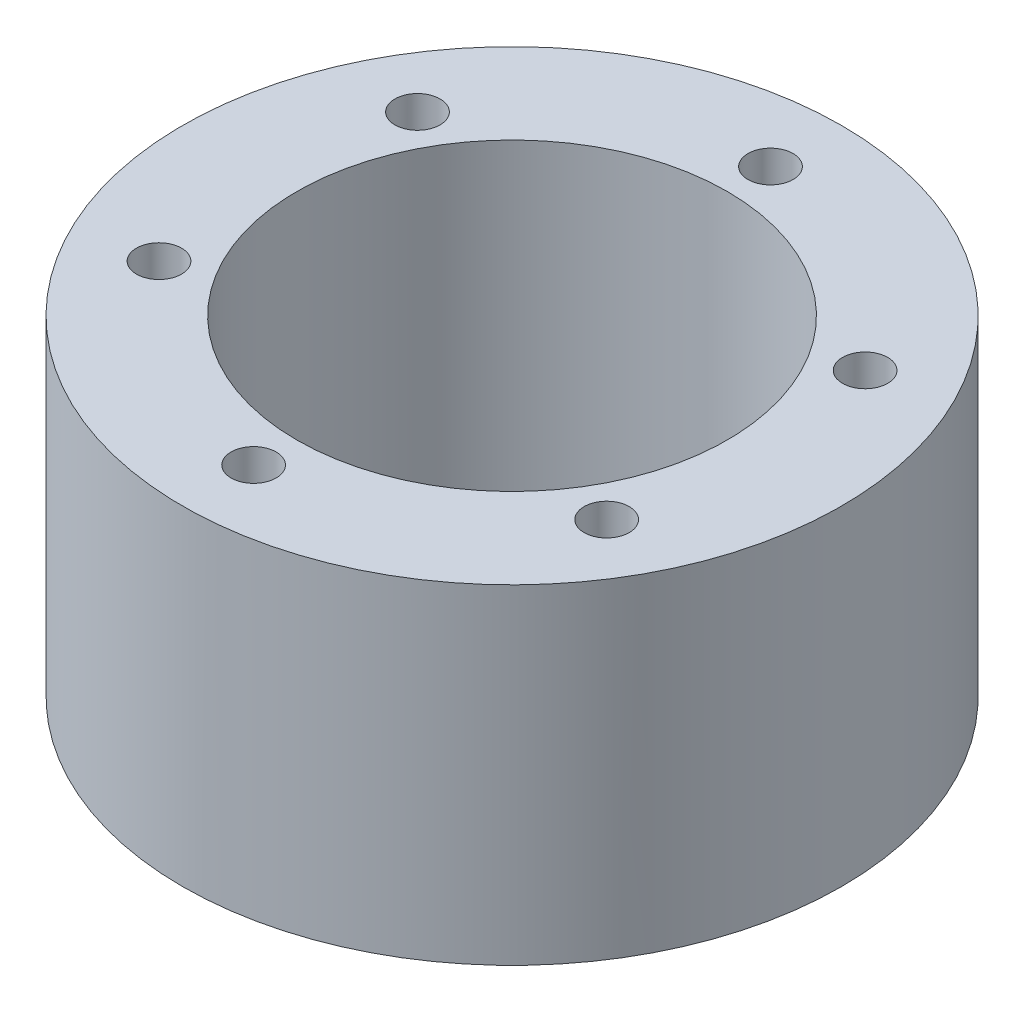
ISO-10303-21;
HEADER;
FILE_DESCRIPTION(('STEP AP214'),'2;1');
FILE_NAME('part.step','',(''),(''),'','','');
FILE_SCHEMA(('AUTOMOTIVE_DESIGN { 1 0 10303 214 1 1 1 1 }'));
ENDSEC;
DATA;
#1=APPLICATION_CONTEXT('core data for automotive mechanical design processes');
#2=APPLICATION_PROTOCOL_DEFINITION('international standard','automotive_design',2000,#1);
#3=PRODUCT_CONTEXT('',#1,'mechanical');
#4=PRODUCT('Part','Part','',(#3));
#5=PRODUCT_RELATED_PRODUCT_CATEGORY('part','',(#4));
#6=PRODUCT_DEFINITION_FORMATION('','',#4);
#7=PRODUCT_DEFINITION_CONTEXT('part definition',#1,'design');
#8=PRODUCT_DEFINITION('design','',#6,#7);
#9=PRODUCT_DEFINITION_SHAPE('','',#8);
#10=(LENGTH_UNIT() NAMED_UNIT(*) SI_UNIT(.MILLI.,.METRE.));
#11=(NAMED_UNIT(*) PLANE_ANGLE_UNIT() SI_UNIT($,.RADIAN.));
#12=(NAMED_UNIT(*) SI_UNIT($,.STERADIAN.) SOLID_ANGLE_UNIT());
#13=UNCERTAINTY_MEASURE_WITH_UNIT(LENGTH_MEASURE(1.E-05),#10,'distance_accuracy_value','');
#14=(GEOMETRIC_REPRESENTATION_CONTEXT(3) GLOBAL_UNCERTAINTY_ASSIGNED_CONTEXT((#13)) GLOBAL_UNIT_ASSIGNED_CONTEXT((#10,
#11,#12)) REPRESENTATION_CONTEXT('',''));
#15=CARTESIAN_POINT('',(0.,0.,0.));
#16=DIRECTION('',(0.,0.,1.));
#17=DIRECTION('',(1.,0.,0.));
#18=AXIS2_PLACEMENT_3D('',#15,#16,#17);
#19=CARTESIAN_POINT('',(47.5,22.5,0.));
#20=DIRECTION('',(0.,1.,0.));
#21=DIRECTION('',(0.,0.,1.));
#22=AXIS2_PLACEMENT_3D('',#19,#20,#21);
#23=PLANE('',#22);
#24=CARTESIAN_POINT('',(0.,22.5,0.));
#25=DIRECTION('',(0.,1.,0.));
#26=DIRECTION('',(0.,0.,1.));
#27=AXIS2_PLACEMENT_3D('',#24,#25,#26);
#28=CIRCLE('',#27,31.025);
#29=CARTESIAN_POINT('',(0.,22.5,31.025));
#30=VERTEX_POINT('',#29);
#31=EDGE_CURVE('E37',#30,#30,#28,.T.);
#32=ORIENTED_EDGE('',*,*,#31,.T.);
#33=EDGE_LOOP('',(#32));
#34=FACE_BOUND('',#33,.T.);
#35=CARTESIAN_POINT('',(0.,22.5,0.));
#36=DIRECTION('',(0.,1.,0.));
#37=DIRECTION('',(0.,0.,1.));
#38=AXIS2_PLACEMENT_3D('',#35,#36,#37);
#39=CIRCLE('',#38,47.5);
#40=CARTESIAN_POINT('',(0.,22.5,47.5));
#41=VERTEX_POINT('',#40);
#42=EDGE_CURVE('E10',#41,#41,#39,.T.);
#43=ORIENTED_EDGE('',*,*,#42,.F.);
#44=EDGE_LOOP('',(#43));
#45=FACE_BOUND('',#44,.T.);
#46=ADVANCED_FACE('F31',(#34,#45),#23,.F.);
#47=CARTESIAN_POINT('',(0.,0.,0.));
#48=DIRECTION('',(0.,-1.,0.));
#49=DIRECTION('',(0.,0.,-1.));
#50=AXIS2_PLACEMENT_3D('',#47,#48,#49);
#51=CYLINDRICAL_SURFACE('',#50,31.025);
#52=ORIENTED_EDGE('',*,*,#31,.F.);
#53=EDGE_LOOP('',(#52));
#54=FACE_BOUND('',#53,.T.);
#55=CARTESIAN_POINT('',(0.,70.,0.));
#56=DIRECTION('',(0.,-1.,0.));
#57=DIRECTION('',(0.,0.,-1.));
#58=AXIS2_PLACEMENT_3D('',#55,#56,#57);
#59=CIRCLE('',#58,31.025);
#60=CARTESIAN_POINT('',(0.,70.,-31.025));
#61=VERTEX_POINT('',#60);
#62=EDGE_CURVE('E41',#61,#61,#59,.T.);
#63=ORIENTED_EDGE('',*,*,#62,.F.);
#64=EDGE_LOOP('',(#63));
#65=FACE_BOUND('',#64,.T.);
#66=ADVANCED_FACE('F100',(#54,#65),#51,.F.);
#67=CARTESIAN_POINT('',(32.5,70.,0.));
#68=DIRECTION('',(0.,1.,0.));
#69=DIRECTION('',(0.,0.,1.));
#70=AXIS2_PLACEMENT_3D('',#67,#68,#69);
#71=PLANE('',#70);
#72=CARTESIAN_POINT('',(-32.2594462909701,70.,-18.6250000000004));
#73=DIRECTION('',(0.,1.,0.));
#74=DIRECTION('',(0.866025403784433,0.,0.50000000000001));
#75=AXIS2_PLACEMENT_3D('',#72,#73,#74);
#76=CIRCLE('',#75,3.25);
#77=CARTESIAN_POINT('',(-29.4448637286707,70.,-17.0000000000003));
#78=VERTEX_POINT('',#77);
#79=EDGE_CURVE('E63',#78,#78,#76,.T.);
#80=ORIENTED_EDGE('',*,*,#79,.F.);
#81=EDGE_LOOP('',(#80));
#82=FACE_BOUND('',#81,.T.);
#83=CARTESIAN_POINT('',(-32.2594462909705,70.,18.6249999999997));
#84=DIRECTION('',(0.,1.,0.));
#85=DIRECTION('',(0.866025403784443,0.,-0.499999999999992));
#86=AXIS2_PLACEMENT_3D('',#83,#84,#85);
#87=CIRCLE('',#86,3.25);
#88=CARTESIAN_POINT('',(-29.4448637286711,70.,16.9999999999997));
#89=VERTEX_POINT('',#88);
#90=EDGE_CURVE('E69',#89,#89,#87,.T.);
#91=ORIENTED_EDGE('',*,*,#90,.F.);
#92=EDGE_LOOP('',(#91));
#93=FACE_BOUND('',#92,.T.);
#94=CARTESIAN_POINT('',(0.,70.,37.25));
#95=DIRECTION('',(0.,1.,0.));
#96=DIRECTION('',(0.,0.,-1.));
#97=AXIS2_PLACEMENT_3D('',#94,#95,#96);
#98=CIRCLE('',#97,3.25);
#99=CARTESIAN_POINT('',(0.,70.,34.));
#100=VERTEX_POINT('',#99);
#101=EDGE_CURVE('E75',#100,#100,#98,.T.);
#102=ORIENTED_EDGE('',*,*,#101,.F.);
#103=EDGE_LOOP('',(#102));
#104=FACE_BOUND('',#103,.T.);
#105=CARTESIAN_POINT('',(32.2594462909703,70.,18.6250000000002));
#106=DIRECTION('',(0.,1.,0.));
#107=DIRECTION('',(-0.866025403784436,0.,-0.500000000000004));
#108=AXIS2_PLACEMENT_3D('',#105,#106,#107);
#109=CIRCLE('',#108,3.25);
#110=CARTESIAN_POINT('',(29.4448637286708,70.,17.0000000000001));
#111=VERTEX_POINT('',#110);
#112=EDGE_CURVE('E81',#111,#111,#109,.T.);
#113=ORIENTED_EDGE('',*,*,#112,.F.);
#114=EDGE_LOOP('',(#113));
#115=FACE_BOUND('',#114,.T.);
#116=CARTESIAN_POINT('',(32.2594462909704,70.,-18.6249999999999));
#117=DIRECTION('',(0.,1.,0.));
#118=DIRECTION('',(-0.86602540378444,0.,0.499999999999998));
#119=AXIS2_PLACEMENT_3D('',#116,#117,#118);
#120=CIRCLE('',#119,3.25);
#121=CARTESIAN_POINT('',(29.444863728671,70.,-16.9999999999999));
#122=VERTEX_POINT('',#121);
#123=EDGE_CURVE('E57',#122,#122,#120,.T.);
#124=ORIENTED_EDGE('',*,*,#123,.F.);
#125=EDGE_LOOP('',(#124));
#126=FACE_BOUND('',#125,.T.);
#127=CARTESIAN_POINT('',(0.,70.,-37.25));
#128=DIRECTION('',(0.,1.,0.));
#129=DIRECTION('',(0.,0.,1.));
#130=AXIS2_PLACEMENT_3D('',#127,#128,#129);
#131=CIRCLE('',#130,3.25);
#132=CARTESIAN_POINT('',(0.,70.,-34.));
#133=VERTEX_POINT('',#132);
#134=EDGE_CURVE('E51',#133,#133,#131,.T.);
#135=ORIENTED_EDGE('',*,*,#134,.F.);
#136=EDGE_LOOP('',(#135));
#137=FACE_BOUND('',#136,.T.);
#138=ORIENTED_EDGE('',*,*,#62,.T.);
#139=EDGE_LOOP('',(#138));
#140=FACE_BOUND('',#139,.T.);
#141=CARTESIAN_POINT('',(0.,70.,0.));
#142=DIRECTION('',(0.,-1.,0.));
#143=DIRECTION('',(0.,0.,-1.));
#144=AXIS2_PLACEMENT_3D('',#141,#142,#143);
#145=CIRCLE('',#144,47.5);
#146=CARTESIAN_POINT('',(0.,70.,-47.5));
#147=VERTEX_POINT('',#146);
#148=EDGE_CURVE('E45',#147,#147,#145,.T.);
#149=ORIENTED_EDGE('',*,*,#148,.F.);
#150=EDGE_LOOP('',(#149));
#151=FACE_BOUND('',#150,.T.);
#152=ADVANCED_FACE('F96',(#82,#93,#104,#115,#126,#137,#140,#151),#71,.T.);
#153=CARTESIAN_POINT('',(0.,0.,0.));
#154=DIRECTION('',(0.,-1.,0.));
#155=DIRECTION('',(0.,0.,-1.));
#156=AXIS2_PLACEMENT_3D('',#153,#154,#155);
#157=CYLINDRICAL_SURFACE('',#156,47.5);
#158=ORIENTED_EDGE('',*,*,#148,.T.);
#159=EDGE_LOOP('',(#158));
#160=FACE_BOUND('',#159,.T.);
#161=ORIENTED_EDGE('',*,*,#42,.T.);
#162=EDGE_LOOP('',(#161));
#163=FACE_BOUND('',#162,.T.);
#164=ADVANCED_FACE('F99',(#160,#163),#157,.T.);
#165=CARTESIAN_POINT('',(0.,50.,-37.25));
#166=DIRECTION('',(0.,1.,0.));
#167=DIRECTION('',(0.,0.,1.));
#168=AXIS2_PLACEMENT_3D('',#165,#166,#167);
#169=CYLINDRICAL_SURFACE('',#168,3.25);
#170=CARTESIAN_POINT('',(0.,50.,-37.25));
#171=DIRECTION('',(0.,1.,0.));
#172=DIRECTION('',(0.,0.,1.));
#173=AXIS2_PLACEMENT_3D('',#170,#171,#172);
#174=CIRCLE('',#173,3.25);
#175=CARTESIAN_POINT('',(0.,50.,-34.));
#176=VERTEX_POINT('',#175);
#177=EDGE_CURVE('E50',#176,#176,#174,.T.);
#178=ORIENTED_EDGE('',*,*,#177,.F.);
#179=EDGE_LOOP('',(#178));
#180=FACE_BOUND('',#179,.T.);
#181=ORIENTED_EDGE('',*,*,#134,.T.);
#182=EDGE_LOOP('',(#181));
#183=FACE_BOUND('',#182,.T.);
#184=ADVANCED_FACE('F112',(#180,#183),#169,.F.);
#185=CARTESIAN_POINT('',(0.,50.,-37.25));
#186=DIRECTION('',(0.,1.,0.));
#187=DIRECTION('',(0.,0.,1.));
#188=AXIS2_PLACEMENT_3D('',#185,#186,#187);
#189=PLANE('',#188);
#190=ORIENTED_EDGE('',*,*,#177,.T.);
#191=EDGE_LOOP('',(#190));
#192=FACE_BOUND('',#191,.T.);
#193=ADVANCED_FACE('F117',(#192),#189,.T.);
#194=CARTESIAN_POINT('',(32.2594462909704,50.,-18.6249999999999));
#195=DIRECTION('',(0.,1.,0.));
#196=DIRECTION('',(0.,0.,1.));
#197=AXIS2_PLACEMENT_3D('',#194,#195,#196);
#198=CYLINDRICAL_SURFACE('',#197,3.25);
#199=CARTESIAN_POINT('',(32.2594462909704,50.,-18.6249999999999));
#200=DIRECTION('',(0.,1.,0.));
#201=DIRECTION('',(-0.86602540378444,0.,0.499999999999998));
#202=AXIS2_PLACEMENT_3D('',#199,#200,#201);
#203=CIRCLE('',#202,3.25);
#204=CARTESIAN_POINT('',(29.444863728671,50.,-16.9999999999999));
#205=VERTEX_POINT('',#204);
#206=EDGE_CURVE('E54',#205,#205,#203,.T.);
#207=ORIENTED_EDGE('',*,*,#206,.F.);
#208=EDGE_LOOP('',(#207));
#209=FACE_BOUND('',#208,.T.);
#210=ORIENTED_EDGE('',*,*,#123,.T.);
#211=EDGE_LOOP('',(#210));
#212=FACE_BOUND('',#211,.T.);
#213=ADVANCED_FACE('F146',(#209,#212),#198,.F.);
#214=CARTESIAN_POINT('',(32.2594462909704,50.,-18.6249999999999));
#215=DIRECTION('',(0.,1.,0.));
#216=DIRECTION('',(-0.86602540378444,0.,0.499999999999998));
#217=AXIS2_PLACEMENT_3D('',#214,#215,#216);
#218=PLANE('',#217);
#219=ORIENTED_EDGE('',*,*,#206,.T.);
#220=EDGE_LOOP('',(#219));
#221=FACE_BOUND('',#220,.T.);
#222=ADVANCED_FACE('F92',(#221),#218,.T.);
#223=CARTESIAN_POINT('',(32.2594462909703,50.,18.6250000000002));
#224=DIRECTION('',(0.,1.,0.));
#225=DIRECTION('',(0.,0.,1.));
#226=AXIS2_PLACEMENT_3D('',#223,#224,#225);
#227=CYLINDRICAL_SURFACE('',#226,3.25);
#228=CARTESIAN_POINT('',(32.2594462909703,50.,18.6250000000002));
#229=DIRECTION('',(0.,1.,0.));
#230=DIRECTION('',(-0.866025403784436,0.,-0.500000000000004));
#231=AXIS2_PLACEMENT_3D('',#228,#229,#230);
#232=CIRCLE('',#231,3.25);
#233=CARTESIAN_POINT('',(29.4448637286708,50.,17.0000000000001));
#234=VERTEX_POINT('',#233);
#235=EDGE_CURVE('E60',#234,#234,#232,.T.);
#236=ORIENTED_EDGE('',*,*,#235,.F.);
#237=EDGE_LOOP('',(#236));
#238=FACE_BOUND('',#237,.T.);
#239=ORIENTED_EDGE('',*,*,#112,.T.);
#240=EDGE_LOOP('',(#239));
#241=FACE_BOUND('',#240,.T.);
#242=ADVANCED_FACE('F89',(#238,#241),#227,.F.);
#243=CARTESIAN_POINT('',(32.2594462909703,50.,18.6250000000002));
#244=DIRECTION('',(0.,1.,0.));
#245=DIRECTION('',(-0.866025403784436,0.,-0.500000000000004));
#246=AXIS2_PLACEMENT_3D('',#243,#244,#245);
#247=PLANE('',#246);
#248=ORIENTED_EDGE('',*,*,#235,.T.);
#249=EDGE_LOOP('',(#248));
#250=FACE_BOUND('',#249,.T.);
#251=ADVANCED_FACE('F87',(#250),#247,.T.);
#252=CARTESIAN_POINT('',(0.,50.,37.25));
#253=DIRECTION('',(0.,1.,0.));
#254=DIRECTION('',(0.,0.,1.));
#255=AXIS2_PLACEMENT_3D('',#252,#253,#254);
#256=CYLINDRICAL_SURFACE('',#255,3.25);
#257=CARTESIAN_POINT('',(0.,50.,37.25));
#258=DIRECTION('',(0.,1.,0.));
#259=DIRECTION('',(0.,0.,-1.));
#260=AXIS2_PLACEMENT_3D('',#257,#258,#259);
#261=CIRCLE('',#260,3.25);
#262=CARTESIAN_POINT('',(0.,50.,34.));
#263=VERTEX_POINT('',#262);
#264=EDGE_CURVE('E78',#263,#263,#261,.T.);
#265=ORIENTED_EDGE('',*,*,#264,.F.);
#266=EDGE_LOOP('',(#265));
#267=FACE_BOUND('',#266,.T.);
#268=ORIENTED_EDGE('',*,*,#101,.T.);
#269=EDGE_LOOP('',(#268));
#270=FACE_BOUND('',#269,.T.);
#271=ADVANCED_FACE('F175',(#267,#270),#256,.F.);
#272=CARTESIAN_POINT('',(0.,50.,37.25));
#273=DIRECTION('',(0.,1.,0.));
#274=DIRECTION('',(0.,0.,-1.));
#275=AXIS2_PLACEMENT_3D('',#272,#273,#274);
#276=PLANE('',#275);
#277=ORIENTED_EDGE('',*,*,#264,.T.);
#278=EDGE_LOOP('',(#277));
#279=FACE_BOUND('',#278,.T.);
#280=ADVANCED_FACE('F184',(#279),#276,.T.);
#281=CARTESIAN_POINT('',(-32.2594462909705,50.,18.6249999999997));
#282=DIRECTION('',(0.,1.,0.));
#283=DIRECTION('',(0.,0.,1.));
#284=AXIS2_PLACEMENT_3D('',#281,#282,#283);
#285=CYLINDRICAL_SURFACE('',#284,3.25);
#286=CARTESIAN_POINT('',(-32.2594462909705,50.,18.6249999999997));
#287=DIRECTION('',(0.,1.,0.));
#288=DIRECTION('',(0.866025403784443,0.,-0.499999999999992));
#289=AXIS2_PLACEMENT_3D('',#286,#287,#288);
#290=CIRCLE('',#289,3.25);
#291=CARTESIAN_POINT('',(-29.4448637286711,50.,16.9999999999997));
#292=VERTEX_POINT('',#291);
#293=EDGE_CURVE('E72',#292,#292,#290,.T.);
#294=ORIENTED_EDGE('',*,*,#293,.F.);
#295=EDGE_LOOP('',(#294));
#296=FACE_BOUND('',#295,.T.);
#297=ORIENTED_EDGE('',*,*,#90,.T.);
#298=EDGE_LOOP('',(#297));
#299=FACE_BOUND('',#298,.T.);
#300=ADVANCED_FACE('F194',(#296,#299),#285,.F.);
#301=CARTESIAN_POINT('',(-32.2594462909705,50.,18.6249999999997));
#302=DIRECTION('',(0.,1.,0.));
#303=DIRECTION('',(0.866025403784443,0.,-0.499999999999992));
#304=AXIS2_PLACEMENT_3D('',#301,#302,#303);
#305=PLANE('',#304);
#306=ORIENTED_EDGE('',*,*,#293,.T.);
#307=EDGE_LOOP('',(#306));
#308=FACE_BOUND('',#307,.T.);
#309=ADVANCED_FACE('F204',(#308),#305,.T.);
#310=CARTESIAN_POINT('',(-32.2594462909701,50.,-18.6250000000004));
#311=DIRECTION('',(0.,1.,0.));
#312=DIRECTION('',(0.,0.,1.));
#313=AXIS2_PLACEMENT_3D('',#310,#311,#312);
#314=CYLINDRICAL_SURFACE('',#313,3.25);
#315=CARTESIAN_POINT('',(-32.2594462909701,50.,-18.6250000000004));
#316=DIRECTION('',(0.,1.,0.));
#317=DIRECTION('',(0.866025403784433,0.,0.50000000000001));
#318=AXIS2_PLACEMENT_3D('',#315,#316,#317);
#319=CIRCLE('',#318,3.25);
#320=CARTESIAN_POINT('',(-29.4448637286707,50.,-17.0000000000003));
#321=VERTEX_POINT('',#320);
#322=EDGE_CURVE('E66',#321,#321,#319,.T.);
#323=ORIENTED_EDGE('',*,*,#322,.F.);
#324=EDGE_LOOP('',(#323));
#325=FACE_BOUND('',#324,.T.);
#326=ORIENTED_EDGE('',*,*,#79,.T.);
#327=EDGE_LOOP('',(#326));
#328=FACE_BOUND('',#327,.T.);
#329=ADVANCED_FACE('F214',(#325,#328),#314,.F.);
#330=CARTESIAN_POINT('',(-32.2594462909701,50.,-18.6250000000004));
#331=DIRECTION('',(0.,1.,0.));
#332=DIRECTION('',(0.866025403784433,0.,0.50000000000001));
#333=AXIS2_PLACEMENT_3D('',#330,#331,#332);
#334=PLANE('',#333);
#335=ORIENTED_EDGE('',*,*,#322,.T.);
#336=EDGE_LOOP('',(#335));
#337=FACE_BOUND('',#336,.T.);
#338=ADVANCED_FACE('F224',(#337),#334,.T.);
#339=CLOSED_SHELL('',(#46,#66,#152,#164,#184,#193,#213,#222,#242,#251,#271,#280,#300,#309,#329,#338));
#340=MANIFOLD_SOLID_BREP('B2',#339);
#341=ADVANCED_BREP_SHAPE_REPRESENTATION('',(#18,#340),#14);
#342=SHAPE_DEFINITION_REPRESENTATION(#9,#341);
ENDSEC;
END-ISO-10303-21;
